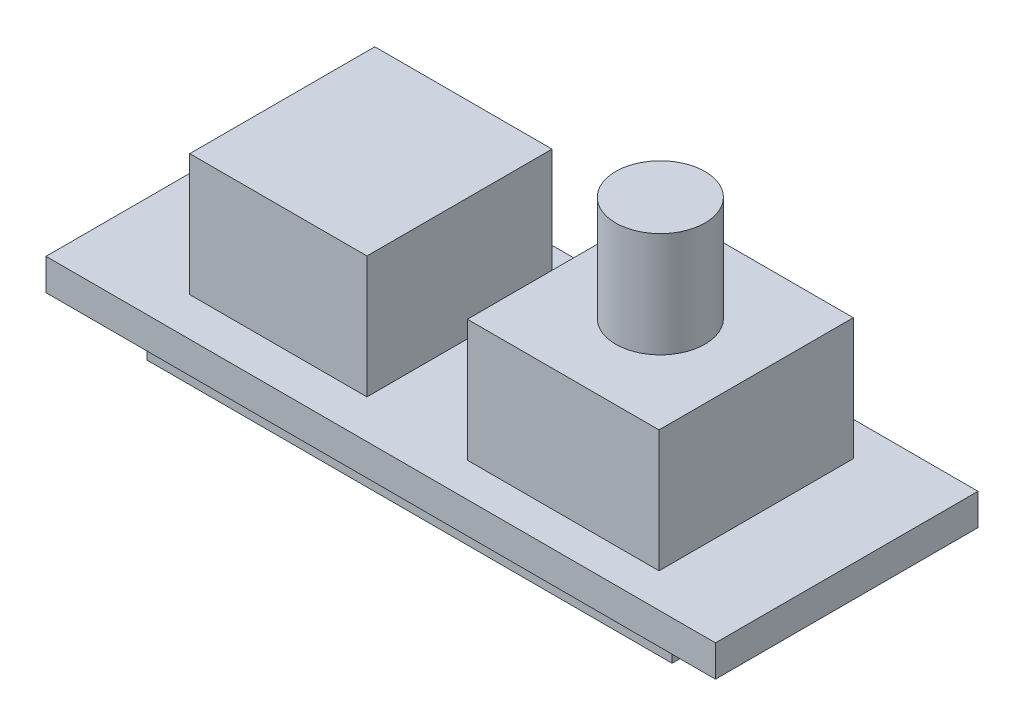
ISO-10303-21;
HEADER;
FILE_DESCRIPTION(('STEP AP214'),'2;1');
FILE_NAME('part.step','',(''),(''),'','','');
FILE_SCHEMA(('AUTOMOTIVE_DESIGN { 1 0 10303 214 1 1 1 1 }'));
ENDSEC;
DATA;
#1=APPLICATION_CONTEXT('core data for automotive mechanical design processes');
#2=APPLICATION_PROTOCOL_DEFINITION('international standard','automotive_design',2000,#1);
#3=PRODUCT_CONTEXT('',#1,'mechanical');
#4=PRODUCT('Part','Part','',(#3));
#5=PRODUCT_RELATED_PRODUCT_CATEGORY('part','',(#4));
#6=PRODUCT_DEFINITION_FORMATION('','',#4);
#7=PRODUCT_DEFINITION_CONTEXT('part definition',#1,'design');
#8=PRODUCT_DEFINITION('design','',#6,#7);
#9=PRODUCT_DEFINITION_SHAPE('','',#8);
#10=(LENGTH_UNIT() NAMED_UNIT(*) SI_UNIT(.MILLI.,.METRE.));
#11=(NAMED_UNIT(*) PLANE_ANGLE_UNIT() SI_UNIT($,.RADIAN.));
#12=(NAMED_UNIT(*) SI_UNIT($,.STERADIAN.) SOLID_ANGLE_UNIT());
#13=UNCERTAINTY_MEASURE_WITH_UNIT(LENGTH_MEASURE(1.E-05),#10,'distance_accuracy_value','');
#14=(GEOMETRIC_REPRESENTATION_CONTEXT(3) GLOBAL_UNCERTAINTY_ASSIGNED_CONTEXT((#13)) GLOBAL_UNIT_ASSIGNED_CONTEXT((#10,
#11,#12)) REPRESENTATION_CONTEXT('',''));
#15=CARTESIAN_POINT('',(0.,0.,0.));
#16=DIRECTION('',(0.,0.,1.));
#17=DIRECTION('',(1.,0.,0.));
#18=AXIS2_PLACEMENT_3D('',#15,#16,#17);
#19=CARTESIAN_POINT('',(0.,0.,0.));
#20=DIRECTION('',(0.,1.,0.));
#21=DIRECTION('',(0.,0.,1.));
#22=AXIS2_PLACEMENT_3D('',#19,#20,#21);
#23=PLANE('',#22);
#24=DIRECTION('',(0.,0.,-1.));
#25=VECTOR('',#24,1.);
#26=CARTESIAN_POINT('',(12.75,0.,-5.));
#27=LINE('',#26,#25);
#28=CARTESIAN_POINT('',(12.75,0.,5.));
#29=VERTEX_POINT('',#28);
#30=CARTESIAN_POINT('',(12.75,0.,-5.));
#31=VERTEX_POINT('',#30);
#32=EDGE_CURVE('E237',#29,#31,#27,.T.);
#33=ORIENTED_EDGE('',*,*,#32,.F.);
#34=DIRECTION('',(1.,0.,0.));
#35=VECTOR('',#34,1.);
#36=CARTESIAN_POINT('',(-12.75,0.,5.));
#37=LINE('',#36,#35);
#38=CARTESIAN_POINT('',(-12.75,0.,5.));
#39=VERTEX_POINT('',#38);
#40=EDGE_CURVE('E242',#39,#29,#37,.T.);
#41=ORIENTED_EDGE('',*,*,#40,.F.);
#42=DIRECTION('',(0.,0.,1.));
#43=VECTOR('',#42,1.);
#44=CARTESIAN_POINT('',(-12.75,0.,-5.));
#45=LINE('',#44,#43);
#46=CARTESIAN_POINT('',(-12.75,0.,-5.));
#47=VERTEX_POINT('',#46);
#48=EDGE_CURVE('E253',#47,#39,#45,.T.);
#49=ORIENTED_EDGE('',*,*,#48,.F.);
#50=DIRECTION('',(-1.,0.,0.));
#51=VECTOR('',#50,1.);
#52=CARTESIAN_POINT('',(-12.75,0.,-5.));
#53=LINE('',#52,#51);
#54=EDGE_CURVE('E251',#31,#47,#53,.T.);
#55=ORIENTED_EDGE('',*,*,#54,.F.);
#56=EDGE_LOOP('',(#33,#41,#49,#55));
#57=FACE_BOUND('',#56,.T.);
#58=DIRECTION('',(0.,0.,1.));
#59=VECTOR('',#58,1.);
#60=CARTESIAN_POINT('',(10.,0.,3.9));
#61=LINE('',#60,#59);
#62=CARTESIAN_POINT('',(10.,0.,-3.9));
#63=VERTEX_POINT('',#62);
#64=CARTESIAN_POINT('',(10.,0.,3.9));
#65=VERTEX_POINT('',#64);
#66=EDGE_CURVE('E167',#63,#65,#61,.T.);
#67=ORIENTED_EDGE('',*,*,#66,.F.);
#68=DIRECTION('',(1.,0.,0.));
#69=VECTOR('',#68,1.);
#70=CARTESIAN_POINT('',(-10.,0.,-3.9));
#71=LINE('',#70,#69);
#72=CARTESIAN_POINT('',(-10.,0.,-3.9));
#73=VERTEX_POINT('',#72);
#74=EDGE_CURVE('E164',#73,#63,#71,.T.);
#75=ORIENTED_EDGE('',*,*,#74,.F.);
#76=DIRECTION('',(0.,0.,-1.));
#77=VECTOR('',#76,1.);
#78=CARTESIAN_POINT('',(-10.,0.,3.9));
#79=LINE('',#78,#77);
#80=CARTESIAN_POINT('',(-10.,0.,3.9));
#81=VERTEX_POINT('',#80);
#82=EDGE_CURVE('E54',#81,#73,#79,.T.);
#83=ORIENTED_EDGE('',*,*,#82,.F.);
#84=DIRECTION('',(-1.,0.,0.));
#85=VECTOR('',#84,1.);
#86=CARTESIAN_POINT('',(-10.,0.,3.9));
#87=LINE('',#86,#85);
#88=EDGE_CURVE('E49',#65,#81,#87,.T.);
#89=ORIENTED_EDGE('',*,*,#88,.F.);
#90=EDGE_LOOP('',(#67,#75,#83,#89));
#91=FACE_BOUND('',#90,.T.);
#92=ADVANCED_FACE('F34',(#57,#91),#23,.F.);
#93=CARTESIAN_POINT('',(0.,1.2,0.));
#94=DIRECTION('',(0.,1.,0.));
#95=DIRECTION('',(0.,0.,1.));
#96=AXIS2_PLACEMENT_3D('',#93,#94,#95);
#97=PLANE('',#96);
#98=DIRECTION('',(0.,0.,-1.));
#99=VECTOR('',#98,1.);
#100=CARTESIAN_POINT('',(12.75,1.2,-5.));
#101=LINE('',#100,#99);
#102=CARTESIAN_POINT('',(12.75,1.2,5.));
#103=VERTEX_POINT('',#102);
#104=CARTESIAN_POINT('',(12.75,1.2,-5.));
#105=VERTEX_POINT('',#104);
#106=EDGE_CURVE('E238',#103,#105,#101,.T.);
#107=ORIENTED_EDGE('',*,*,#106,.T.);
#108=DIRECTION('',(-1.,0.,0.));
#109=VECTOR('',#108,1.);
#110=CARTESIAN_POINT('',(-12.75,1.2,-5.));
#111=LINE('',#110,#109);
#112=CARTESIAN_POINT('',(-12.75,1.2,-5.));
#113=VERTEX_POINT('',#112);
#114=EDGE_CURVE('E241',#105,#113,#111,.T.);
#115=ORIENTED_EDGE('',*,*,#114,.T.);
#116=DIRECTION('',(0.,0.,1.));
#117=VECTOR('',#116,1.);
#118=CARTESIAN_POINT('',(-12.75,1.2,-5.));
#119=LINE('',#118,#117);
#120=CARTESIAN_POINT('',(-12.75,1.2,5.));
#121=VERTEX_POINT('',#120);
#122=EDGE_CURVE('E244',#113,#121,#119,.T.);
#123=ORIENTED_EDGE('',*,*,#122,.T.);
#124=DIRECTION('',(1.,0.,0.));
#125=VECTOR('',#124,1.);
#126=CARTESIAN_POINT('',(-12.75,1.2,5.));
#127=LINE('',#126,#125);
#128=EDGE_CURVE('E246',#121,#103,#127,.T.);
#129=ORIENTED_EDGE('',*,*,#128,.T.);
#130=EDGE_LOOP('',(#107,#115,#123,#129));
#131=FACE_BOUND('',#130,.T.);
#132=DIRECTION('',(-1.,0.,0.));
#133=VECTOR('',#132,1.);
#134=CARTESIAN_POINT('',(-8.75,1.2,-3.525));
#135=LINE('',#134,#133);
#136=CARTESIAN_POINT('',(-2.,1.2,-3.52500000000001));
#137=VERTEX_POINT('',#136);
#138=CARTESIAN_POINT('',(-8.75,1.2,-3.525));
#139=VERTEX_POINT('',#138);
#140=EDGE_CURVE('E222',#137,#139,#135,.T.);
#141=ORIENTED_EDGE('',*,*,#140,.F.);
#142=DIRECTION('',(0.,0.,-1.));
#143=VECTOR('',#142,1.);
#144=CARTESIAN_POINT('',(-2.,1.2,-3.52500000000001));
#145=LINE('',#144,#143);
#146=CARTESIAN_POINT('',(-2.,1.2,3.525));
#147=VERTEX_POINT('',#146);
#148=EDGE_CURVE('E208',#147,#137,#145,.T.);
#149=ORIENTED_EDGE('',*,*,#148,.F.);
#150=DIRECTION('',(1.,0.,0.));
#151=VECTOR('',#150,1.);
#152=CARTESIAN_POINT('',(-8.75,1.2,3.525));
#153=LINE('',#152,#151);
#154=CARTESIAN_POINT('',(-8.75,1.2,3.525));
#155=VERTEX_POINT('',#154);
#156=EDGE_CURVE('E213',#155,#147,#153,.T.);
#157=ORIENTED_EDGE('',*,*,#156,.F.);
#158=DIRECTION('',(0.,0.,1.));
#159=VECTOR('',#158,1.);
#160=CARTESIAN_POINT('',(-8.75,1.2,-3.525));
#161=LINE('',#160,#159);
#162=EDGE_CURVE('E224',#139,#155,#161,.T.);
#163=ORIENTED_EDGE('',*,*,#162,.F.);
#164=EDGE_LOOP('',(#141,#149,#157,#163));
#165=FACE_BOUND('',#164,.T.);
#166=DIRECTION('',(-1.,0.,0.));
#167=VECTOR('',#166,1.);
#168=CARTESIAN_POINT('',(2.,1.2,-3.7));
#169=LINE('',#168,#167);
#170=CARTESIAN_POINT('',(9.3,1.2,-3.7));
#171=VERTEX_POINT('',#170);
#172=CARTESIAN_POINT('',(2.,1.2,-3.7));
#173=VERTEX_POINT('',#172);
#174=EDGE_CURVE('E193',#171,#173,#169,.T.);
#175=ORIENTED_EDGE('',*,*,#174,.F.);
#176=DIRECTION('',(0.,0.,-1.));
#177=VECTOR('',#176,1.);
#178=CARTESIAN_POINT('',(9.3,1.2,-3.7));
#179=LINE('',#178,#177);
#180=CARTESIAN_POINT('',(9.30000000000001,1.2,3.7));
#181=VERTEX_POINT('',#180);
#182=EDGE_CURVE('E178',#181,#171,#179,.T.);
#183=ORIENTED_EDGE('',*,*,#182,.F.);
#184=DIRECTION('',(1.,0.,0.));
#185=VECTOR('',#184,1.);
#186=CARTESIAN_POINT('',(2.,1.2,3.7));
#187=LINE('',#186,#185);
#188=CARTESIAN_POINT('',(2.,1.2,3.7));
#189=VERTEX_POINT('',#188);
#190=EDGE_CURVE('E184',#189,#181,#187,.T.);
#191=ORIENTED_EDGE('',*,*,#190,.F.);
#192=DIRECTION('',(0.,0.,1.));
#193=VECTOR('',#192,1.);
#194=CARTESIAN_POINT('',(2.,1.2,-3.7));
#195=LINE('',#194,#193);
#196=EDGE_CURVE('E195',#173,#189,#195,.T.);
#197=ORIENTED_EDGE('',*,*,#196,.F.);
#198=EDGE_LOOP('',(#175,#183,#191,#197));
#199=FACE_BOUND('',#198,.T.);
#200=ADVANCED_FACE('F279',(#131,#165,#199),#97,.T.);
#201=CARTESIAN_POINT('',(12.75,1.2,-5.));
#202=DIRECTION('',(-1.,0.,0.));
#203=DIRECTION('',(0.,0.,1.));
#204=AXIS2_PLACEMENT_3D('',#201,#202,#203);
#205=PLANE('',#204);
#206=ORIENTED_EDGE('',*,*,#32,.T.);
#207=DIRECTION('',(0.,-1.,0.));
#208=VECTOR('',#207,1.);
#209=CARTESIAN_POINT('',(12.75,1.2,-5.));
#210=LINE('',#209,#208);
#211=EDGE_CURVE('E11',#105,#31,#210,.T.);
#212=ORIENTED_EDGE('',*,*,#211,.F.);
#213=ORIENTED_EDGE('',*,*,#106,.F.);
#214=DIRECTION('',(0.,-1.,0.));
#215=VECTOR('',#214,1.);
#216=CARTESIAN_POINT('',(12.75,1.2,5.));
#217=LINE('',#216,#215);
#218=EDGE_CURVE('E248',#103,#29,#217,.T.);
#219=ORIENTED_EDGE('',*,*,#218,.T.);
#220=EDGE_LOOP('',(#206,#212,#213,#219));
#221=FACE_BOUND('',#220,.T.);
#222=ADVANCED_FACE('F36',(#221),#205,.F.);
#223=CARTESIAN_POINT('',(-12.75,1.2,-5.));
#224=DIRECTION('',(0.,0.,1.));
#225=DIRECTION('',(1.,0.,0.));
#226=AXIS2_PLACEMENT_3D('',#223,#224,#225);
#227=PLANE('',#226);
#228=ORIENTED_EDGE('',*,*,#54,.T.);
#229=DIRECTION('',(0.,-1.,0.));
#230=VECTOR('',#229,1.);
#231=CARTESIAN_POINT('',(-12.75,1.2,-5.));
#232=LINE('',#231,#230);
#233=EDGE_CURVE('E42',#113,#47,#232,.T.);
#234=ORIENTED_EDGE('',*,*,#233,.F.);
#235=ORIENTED_EDGE('',*,*,#114,.F.);
#236=ORIENTED_EDGE('',*,*,#211,.T.);
#237=EDGE_LOOP('',(#228,#234,#235,#236));
#238=FACE_BOUND('',#237,.T.);
#239=ADVANCED_FACE('F281',(#238),#227,.F.);
#240=CARTESIAN_POINT('',(-12.75,1.2,-5.));
#241=DIRECTION('',(1.,0.,0.));
#242=DIRECTION('',(0.,0.,-1.));
#243=AXIS2_PLACEMENT_3D('',#240,#241,#242);
#244=PLANE('',#243);
#245=ORIENTED_EDGE('',*,*,#48,.T.);
#246=DIRECTION('',(0.,-1.,0.));
#247=VECTOR('',#246,1.);
#248=CARTESIAN_POINT('',(-12.75,1.2,5.));
#249=LINE('',#248,#247);
#250=EDGE_CURVE('E258',#121,#39,#249,.T.);
#251=ORIENTED_EDGE('',*,*,#250,.F.);
#252=ORIENTED_EDGE('',*,*,#122,.F.);
#253=ORIENTED_EDGE('',*,*,#233,.T.);
#254=EDGE_LOOP('',(#245,#251,#252,#253));
#255=FACE_BOUND('',#254,.T.);
#256=ADVANCED_FACE('F265',(#255),#244,.F.);
#257=CARTESIAN_POINT('',(-12.75,1.2,5.));
#258=DIRECTION('',(0.,0.,-1.));
#259=DIRECTION('',(-1.,0.,0.));
#260=AXIS2_PLACEMENT_3D('',#257,#258,#259);
#261=PLANE('',#260);
#262=ORIENTED_EDGE('',*,*,#40,.T.);
#263=ORIENTED_EDGE('',*,*,#218,.F.);
#264=ORIENTED_EDGE('',*,*,#128,.F.);
#265=ORIENTED_EDGE('',*,*,#250,.T.);
#266=EDGE_LOOP('',(#262,#263,#264,#265));
#267=FACE_BOUND('',#266,.T.);
#268=ADVANCED_FACE('F273',(#267),#261,.F.);
#269=CARTESIAN_POINT('',(-2.,5.85,-3.52500000000001));
#270=DIRECTION('',(-1.,0.,0.));
#271=DIRECTION('',(0.,0.,1.));
#272=AXIS2_PLACEMENT_3D('',#269,#270,#271);
#273=PLANE('',#272);
#274=ORIENTED_EDGE('',*,*,#148,.T.);
#275=DIRECTION('',(0.,-1.,0.));
#276=VECTOR('',#275,1.);
#277=CARTESIAN_POINT('',(-2.,5.85,-3.52500000000001));
#278=LINE('',#277,#276);
#279=CARTESIAN_POINT('',(-2.,5.85,-3.52500000000001));
#280=VERTEX_POINT('',#279);
#281=EDGE_CURVE('E235',#280,#137,#278,.T.);
#282=ORIENTED_EDGE('',*,*,#281,.F.);
#283=DIRECTION('',(0.,0.,-1.));
#284=VECTOR('',#283,1.);
#285=CARTESIAN_POINT('',(-2.,5.85,-3.52500000000001));
#286=LINE('',#285,#284);
#287=CARTESIAN_POINT('',(-2.,5.85,3.525));
#288=VERTEX_POINT('',#287);
#289=EDGE_CURVE('E209',#288,#280,#286,.T.);
#290=ORIENTED_EDGE('',*,*,#289,.F.);
#291=DIRECTION('',(0.,-1.,0.));
#292=VECTOR('',#291,1.);
#293=CARTESIAN_POINT('',(-2.,5.85,3.525));
#294=LINE('',#293,#292);
#295=EDGE_CURVE('E219',#288,#147,#294,.T.);
#296=ORIENTED_EDGE('',*,*,#295,.T.);
#297=EDGE_LOOP('',(#274,#282,#290,#296));
#298=FACE_BOUND('',#297,.T.);
#299=ADVANCED_FACE('F297',(#298),#273,.F.);
#300=CARTESIAN_POINT('',(-8.75,5.85,-3.525));
#301=DIRECTION('',(0.,0.,1.));
#302=DIRECTION('',(1.,0.,0.));
#303=AXIS2_PLACEMENT_3D('',#300,#301,#302);
#304=PLANE('',#303);
#305=ORIENTED_EDGE('',*,*,#140,.T.);
#306=DIRECTION('',(0.,-1.,0.));
#307=VECTOR('',#306,1.);
#308=CARTESIAN_POINT('',(-8.75,5.85,-3.525));
#309=LINE('',#308,#307);
#310=CARTESIAN_POINT('',(-8.75,5.85,-3.525));
#311=VERTEX_POINT('',#310);
#312=EDGE_CURVE('E232',#311,#139,#309,.T.);
#313=ORIENTED_EDGE('',*,*,#312,.F.);
#314=DIRECTION('',(-1.,0.,0.));
#315=VECTOR('',#314,1.);
#316=CARTESIAN_POINT('',(-8.75,5.85,-3.525));
#317=LINE('',#316,#315);
#318=EDGE_CURVE('E212',#280,#311,#317,.T.);
#319=ORIENTED_EDGE('',*,*,#318,.F.);
#320=ORIENTED_EDGE('',*,*,#281,.T.);
#321=EDGE_LOOP('',(#305,#313,#319,#320));
#322=FACE_BOUND('',#321,.T.);
#323=ADVANCED_FACE('F301',(#322),#304,.F.);
#324=CARTESIAN_POINT('',(-8.75,5.85,-3.525));
#325=DIRECTION('',(1.,0.,0.));
#326=DIRECTION('',(0.,0.,-1.));
#327=AXIS2_PLACEMENT_3D('',#324,#325,#326);
#328=PLANE('',#327);
#329=ORIENTED_EDGE('',*,*,#162,.T.);
#330=DIRECTION('',(0.,-1.,0.));
#331=VECTOR('',#330,1.);
#332=CARTESIAN_POINT('',(-8.75,5.85,3.525));
#333=LINE('',#332,#331);
#334=CARTESIAN_POINT('',(-8.75,5.85,3.525));
#335=VERTEX_POINT('',#334);
#336=EDGE_CURVE('E230',#335,#155,#333,.T.);
#337=ORIENTED_EDGE('',*,*,#336,.F.);
#338=DIRECTION('',(0.,0.,1.));
#339=VECTOR('',#338,1.);
#340=CARTESIAN_POINT('',(-8.75,5.85,-3.525));
#341=LINE('',#340,#339);
#342=EDGE_CURVE('E215',#311,#335,#341,.T.);
#343=ORIENTED_EDGE('',*,*,#342,.F.);
#344=ORIENTED_EDGE('',*,*,#312,.T.);
#345=EDGE_LOOP('',(#329,#337,#343,#344));
#346=FACE_BOUND('',#345,.T.);
#347=ADVANCED_FACE('F306',(#346),#328,.F.);
#348=CARTESIAN_POINT('',(-8.75,5.85,3.525));
#349=DIRECTION('',(0.,0.,-1.));
#350=DIRECTION('',(-1.,0.,0.));
#351=AXIS2_PLACEMENT_3D('',#348,#349,#350);
#352=PLANE('',#351);
#353=ORIENTED_EDGE('',*,*,#156,.T.);
#354=ORIENTED_EDGE('',*,*,#295,.F.);
#355=DIRECTION('',(1.,0.,0.));
#356=VECTOR('',#355,1.);
#357=CARTESIAN_POINT('',(-8.75,5.85,3.525));
#358=LINE('',#357,#356);
#359=EDGE_CURVE('E217',#335,#288,#358,.T.);
#360=ORIENTED_EDGE('',*,*,#359,.F.);
#361=ORIENTED_EDGE('',*,*,#336,.T.);
#362=EDGE_LOOP('',(#353,#354,#360,#361));
#363=FACE_BOUND('',#362,.T.);
#364=ADVANCED_FACE('F312',(#363),#352,.F.);
#365=CARTESIAN_POINT('',(0.,5.85,0.));
#366=DIRECTION('',(0.,1.,0.));
#367=DIRECTION('',(0.,0.,1.));
#368=AXIS2_PLACEMENT_3D('',#365,#366,#367);
#369=PLANE('',#368);
#370=ORIENTED_EDGE('',*,*,#289,.T.);
#371=ORIENTED_EDGE('',*,*,#318,.T.);
#372=ORIENTED_EDGE('',*,*,#342,.T.);
#373=ORIENTED_EDGE('',*,*,#359,.T.);
#374=EDGE_LOOP('',(#370,#371,#372,#373));
#375=FACE_BOUND('',#374,.T.);
#376=ADVANCED_FACE('F316',(#375),#369,.T.);
#377=CARTESIAN_POINT('',(9.3,5.85,-3.7));
#378=DIRECTION('',(-1.,0.,0.));
#379=DIRECTION('',(0.,0.,1.));
#380=AXIS2_PLACEMENT_3D('',#377,#378,#379);
#381=PLANE('',#380);
#382=ORIENTED_EDGE('',*,*,#182,.T.);
#383=DIRECTION('',(0.,-1.,0.));
#384=VECTOR('',#383,1.);
#385=CARTESIAN_POINT('',(9.3,5.85,-3.7));
#386=LINE('',#385,#384);
#387=CARTESIAN_POINT('',(9.3,5.85,-3.7));
#388=VERTEX_POINT('',#387);
#389=EDGE_CURVE('E206',#388,#171,#386,.T.);
#390=ORIENTED_EDGE('',*,*,#389,.F.);
#391=DIRECTION('',(0.,0.,-1.));
#392=VECTOR('',#391,1.);
#393=CARTESIAN_POINT('',(9.3,5.85,-3.7));
#394=LINE('',#393,#392);
#395=CARTESIAN_POINT('',(9.30000000000001,5.85,3.7));
#396=VERTEX_POINT('',#395);
#397=EDGE_CURVE('E180',#396,#388,#394,.T.);
#398=ORIENTED_EDGE('',*,*,#397,.F.);
#399=DIRECTION('',(0.,-1.,0.));
#400=VECTOR('',#399,1.);
#401=CARTESIAN_POINT('',(9.30000000000001,5.85,3.7));
#402=LINE('',#401,#400);
#403=EDGE_CURVE('E190',#396,#181,#402,.T.);
#404=ORIENTED_EDGE('',*,*,#403,.T.);
#405=EDGE_LOOP('',(#382,#390,#398,#404));
#406=FACE_BOUND('',#405,.T.);
#407=ADVANCED_FACE('F320',(#406),#381,.F.);
#408=CARTESIAN_POINT('',(2.,5.85,-3.7));
#409=DIRECTION('',(0.,0.,1.));
#410=DIRECTION('',(1.,0.,0.));
#411=AXIS2_PLACEMENT_3D('',#408,#409,#410);
#412=PLANE('',#411);
#413=ORIENTED_EDGE('',*,*,#174,.T.);
#414=DIRECTION('',(0.,-1.,0.));
#415=VECTOR('',#414,1.);
#416=CARTESIAN_POINT('',(2.,5.85,-3.7));
#417=LINE('',#416,#415);
#418=CARTESIAN_POINT('',(2.,5.85,-3.7));
#419=VERTEX_POINT('',#418);
#420=EDGE_CURVE('E203',#419,#173,#417,.T.);
#421=ORIENTED_EDGE('',*,*,#420,.F.);
#422=DIRECTION('',(-1.,0.,0.));
#423=VECTOR('',#422,1.);
#424=CARTESIAN_POINT('',(2.,5.85,-3.7));
#425=LINE('',#424,#423);
#426=EDGE_CURVE('E183',#388,#419,#425,.T.);
#427=ORIENTED_EDGE('',*,*,#426,.F.);
#428=ORIENTED_EDGE('',*,*,#389,.T.);
#429=EDGE_LOOP('',(#413,#421,#427,#428));
#430=FACE_BOUND('',#429,.T.);
#431=ADVANCED_FACE('F324',(#430),#412,.F.);
#432=CARTESIAN_POINT('',(2.,5.85,-3.7));
#433=DIRECTION('',(1.,0.,0.));
#434=DIRECTION('',(0.,0.,-1.));
#435=AXIS2_PLACEMENT_3D('',#432,#433,#434);
#436=PLANE('',#435);
#437=ORIENTED_EDGE('',*,*,#196,.T.);
#438=DIRECTION('',(0.,-1.,0.));
#439=VECTOR('',#438,1.);
#440=CARTESIAN_POINT('',(2.,5.85,3.7));
#441=LINE('',#440,#439);
#442=CARTESIAN_POINT('',(2.,5.85,3.7));
#443=VERTEX_POINT('',#442);
#444=EDGE_CURVE('E201',#443,#189,#441,.T.);
#445=ORIENTED_EDGE('',*,*,#444,.F.);
#446=DIRECTION('',(0.,0.,1.));
#447=VECTOR('',#446,1.);
#448=CARTESIAN_POINT('',(2.,5.85,-3.7));
#449=LINE('',#448,#447);
#450=EDGE_CURVE('E186',#419,#443,#449,.T.);
#451=ORIENTED_EDGE('',*,*,#450,.F.);
#452=ORIENTED_EDGE('',*,*,#420,.T.);
#453=EDGE_LOOP('',(#437,#445,#451,#452));
#454=FACE_BOUND('',#453,.T.);
#455=ADVANCED_FACE('F328',(#454),#436,.F.);
#456=CARTESIAN_POINT('',(2.,5.85,3.7));
#457=DIRECTION('',(0.,0.,-1.));
#458=DIRECTION('',(-1.,0.,0.));
#459=AXIS2_PLACEMENT_3D('',#456,#457,#458);
#460=PLANE('',#459);
#461=ORIENTED_EDGE('',*,*,#190,.T.);
#462=ORIENTED_EDGE('',*,*,#403,.F.);
#463=DIRECTION('',(1.,0.,0.));
#464=VECTOR('',#463,1.);
#465=CARTESIAN_POINT('',(2.,5.85,3.7));
#466=LINE('',#465,#464);
#467=EDGE_CURVE('E188',#443,#396,#466,.T.);
#468=ORIENTED_EDGE('',*,*,#467,.F.);
#469=ORIENTED_EDGE('',*,*,#444,.T.);
#470=EDGE_LOOP('',(#461,#462,#468,#469));
#471=FACE_BOUND('',#470,.T.);
#472=ADVANCED_FACE('F332',(#471),#460,.F.);
#473=CARTESIAN_POINT('',(0.,5.85,0.));
#474=DIRECTION('',(0.,1.,0.));
#475=DIRECTION('',(0.,0.,1.));
#476=AXIS2_PLACEMENT_3D('',#473,#474,#475);
#477=PLANE('',#476);
#478=CARTESIAN_POINT('',(5.65,5.85,0.));
#479=DIRECTION('',(0.,1.,0.));
#480=DIRECTION('',(0.,0.,1.));
#481=AXIS2_PLACEMENT_3D('',#478,#479,#480);
#482=CIRCLE('',#481,1.7);
#483=CARTESIAN_POINT('',(5.65,5.85,1.7));
#484=VERTEX_POINT('',#483);
#485=EDGE_CURVE('E168',#484,#484,#482,.T.);
#486=ORIENTED_EDGE('',*,*,#485,.F.);
#487=EDGE_LOOP('',(#486));
#488=FACE_BOUND('',#487,.T.);
#489=ORIENTED_EDGE('',*,*,#397,.T.);
#490=ORIENTED_EDGE('',*,*,#426,.T.);
#491=ORIENTED_EDGE('',*,*,#450,.T.);
#492=ORIENTED_EDGE('',*,*,#467,.T.);
#493=EDGE_LOOP('',(#489,#490,#491,#492));
#494=FACE_BOUND('',#493,.T.);
#495=ADVANCED_FACE('F336',(#488,#494),#477,.T.);
#496=CARTESIAN_POINT('',(5.65,9.85,0.));
#497=DIRECTION('',(0.,-1.,0.));
#498=DIRECTION('',(0.,0.,-1.));
#499=AXIS2_PLACEMENT_3D('',#496,#497,#498);
#500=CYLINDRICAL_SURFACE('',#499,1.7);
#501=CARTESIAN_POINT('',(5.65,9.85,0.));
#502=DIRECTION('',(0.,1.,0.));
#503=DIRECTION('',(0.,0.,1.));
#504=AXIS2_PLACEMENT_3D('',#501,#502,#503);
#505=CIRCLE('',#504,1.7);
#506=CARTESIAN_POINT('',(5.65,9.85,1.7));
#507=VERTEX_POINT('',#506);
#508=EDGE_CURVE('E171',#507,#507,#505,.T.);
#509=ORIENTED_EDGE('',*,*,#508,.F.);
#510=EDGE_LOOP('',(#509));
#511=FACE_BOUND('',#510,.T.);
#512=ORIENTED_EDGE('',*,*,#485,.T.);
#513=EDGE_LOOP('',(#512));
#514=FACE_BOUND('',#513,.T.);
#515=ADVANCED_FACE('F340',(#511,#514),#500,.T.);
#516=CARTESIAN_POINT('',(5.65,9.85,0.));
#517=DIRECTION('',(0.,1.,0.));
#518=DIRECTION('',(0.,0.,1.));
#519=AXIS2_PLACEMENT_3D('',#516,#517,#518);
#520=PLANE('',#519);
#521=ORIENTED_EDGE('',*,*,#508,.T.);
#522=EDGE_LOOP('',(#521));
#523=FACE_BOUND('',#522,.T.);
#524=ADVANCED_FACE('F344',(#523),#520,.T.);
#525=CARTESIAN_POINT('',(10.,-1.4,3.9));
#526=DIRECTION('',(-1.,0.,0.));
#527=DIRECTION('',(0.,0.,1.));
#528=AXIS2_PLACEMENT_3D('',#525,#526,#527);
#529=PLANE('',#528);
#530=ORIENTED_EDGE('',*,*,#66,.T.);
#531=DIRECTION('',(0.,1.,0.));
#532=VECTOR('',#531,1.);
#533=CARTESIAN_POINT('',(10.,-1.4,3.9));
#534=LINE('',#533,#532);
#535=CARTESIAN_POINT('',(10.,-1.4,3.9));
#536=VERTEX_POINT('',#535);
#537=EDGE_CURVE('E148',#536,#65,#534,.T.);
#538=ORIENTED_EDGE('',*,*,#537,.F.);
#539=DIRECTION('',(0.,0.,1.));
#540=VECTOR('',#539,1.);
#541=CARTESIAN_POINT('',(10.,-1.4,3.9));
#542=LINE('',#541,#540);
#543=CARTESIAN_POINT('',(10.,-1.4,-3.9));
#544=VERTEX_POINT('',#543);
#545=EDGE_CURVE('E155',#544,#536,#542,.T.);
#546=ORIENTED_EDGE('',*,*,#545,.F.);
#547=DIRECTION('',(0.,1.,0.));
#548=VECTOR('',#547,1.);
#549=CARTESIAN_POINT('',(10.,-1.4,-3.9));
#550=LINE('',#549,#548);
#551=EDGE_CURVE('E494',#544,#63,#550,.T.);
#552=ORIENTED_EDGE('',*,*,#551,.T.);
#553=EDGE_LOOP('',(#530,#538,#546,#552));
#554=FACE_BOUND('',#553,.T.);
#555=ADVANCED_FACE('F166',(#554),#529,.F.);
#556=CARTESIAN_POINT('',(-10.,-1.4,3.9));
#557=DIRECTION('',(0.,0.,-1.));
#558=DIRECTION('',(-1.,0.,0.));
#559=AXIS2_PLACEMENT_3D('',#556,#557,#558);
#560=PLANE('',#559);
#561=ORIENTED_EDGE('',*,*,#88,.T.);
#562=DIRECTION('',(0.,1.,0.));
#563=VECTOR('',#562,1.);
#564=CARTESIAN_POINT('',(-10.,-1.4,3.9));
#565=LINE('',#564,#563);
#566=CARTESIAN_POINT('',(-10.,-1.4,3.9));
#567=VERTEX_POINT('',#566);
#568=EDGE_CURVE('E151',#567,#81,#565,.T.);
#569=ORIENTED_EDGE('',*,*,#568,.F.);
#570=DIRECTION('',(-1.,0.,0.));
#571=VECTOR('',#570,1.);
#572=CARTESIAN_POINT('',(-10.,-1.4,3.9));
#573=LINE('',#572,#571);
#574=EDGE_CURVE('E144',#536,#567,#573,.T.);
#575=ORIENTED_EDGE('',*,*,#574,.F.);
#576=ORIENTED_EDGE('',*,*,#537,.T.);
#577=EDGE_LOOP('',(#561,#569,#575,#576));
#578=FACE_BOUND('',#577,.T.);
#579=ADVANCED_FACE('F146',(#578),#560,.F.);
#580=CARTESIAN_POINT('',(-10.,-1.4,3.9));
#581=DIRECTION('',(1.,0.,0.));
#582=DIRECTION('',(0.,0.,-1.));
#583=AXIS2_PLACEMENT_3D('',#580,#581,#582);
#584=PLANE('',#583);
#585=ORIENTED_EDGE('',*,*,#82,.T.);
#586=DIRECTION('',(0.,1.,0.));
#587=VECTOR('',#586,1.);
#588=CARTESIAN_POINT('',(-10.,-1.4,-3.9));
#589=LINE('',#588,#587);
#590=CARTESIAN_POINT('',(-10.,-1.4,-3.9));
#591=VERTEX_POINT('',#590);
#592=EDGE_CURVE('E173',#591,#73,#589,.T.);
#593=ORIENTED_EDGE('',*,*,#592,.F.);
#594=DIRECTION('',(0.,0.,-1.));
#595=VECTOR('',#594,1.);
#596=CARTESIAN_POINT('',(-10.,-1.4,3.9));
#597=LINE('',#596,#595);
#598=EDGE_CURVE('E154',#567,#591,#597,.T.);
#599=ORIENTED_EDGE('',*,*,#598,.F.);
#600=ORIENTED_EDGE('',*,*,#568,.T.);
#601=EDGE_LOOP('',(#585,#593,#599,#600));
#602=FACE_BOUND('',#601,.T.);
#603=ADVANCED_FACE('F353',(#602),#584,.F.);
#604=CARTESIAN_POINT('',(-10.,-1.4,-3.9));
#605=DIRECTION('',(0.,0.,1.));
#606=DIRECTION('',(1.,0.,0.));
#607=AXIS2_PLACEMENT_3D('',#604,#605,#606);
#608=PLANE('',#607);
#609=ORIENTED_EDGE('',*,*,#74,.T.);
#610=ORIENTED_EDGE('',*,*,#551,.F.);
#611=DIRECTION('',(1.,0.,0.));
#612=VECTOR('',#611,1.);
#613=CARTESIAN_POINT('',(-10.,-1.4,-3.9));
#614=LINE('',#613,#612);
#615=EDGE_CURVE('E160',#591,#544,#614,.T.);
#616=ORIENTED_EDGE('',*,*,#615,.F.);
#617=ORIENTED_EDGE('',*,*,#592,.T.);
#618=EDGE_LOOP('',(#609,#610,#616,#617));
#619=FACE_BOUND('',#618,.T.);
#620=ADVANCED_FACE('F356',(#619),#608,.F.);
#621=CARTESIAN_POINT('',(0.,-1.4,0.));
#622=DIRECTION('',(0.,-1.,0.));
#623=DIRECTION('',(0.,0.,-1.));
#624=AXIS2_PLACEMENT_3D('',#621,#622,#623);
#625=PLANE('',#624);
#626=ORIENTED_EDGE('',*,*,#545,.T.);
#627=ORIENTED_EDGE('',*,*,#574,.T.);
#628=ORIENTED_EDGE('',*,*,#598,.T.);
#629=ORIENTED_EDGE('',*,*,#615,.T.);
#630=EDGE_LOOP('',(#626,#627,#628,#629));
#631=FACE_BOUND('',#630,.T.);
#632=ADVANCED_FACE('F158',(#631),#625,.T.);
#633=CLOSED_SHELL('',(#92,#200,#222,#239,#256,#268,#299,#323,#347,#364,#376,#407,#431,#455,#472,
#495,#515,#524,#555,#579,#603,#620,#632));
#634=MANIFOLD_SOLID_BREP('B2',#633);
#635=ADVANCED_BREP_SHAPE_REPRESENTATION('',(#18,#634),#14);
#636=SHAPE_DEFINITION_REPRESENTATION(#9,#635);
ENDSEC;
END-ISO-10303-21;
